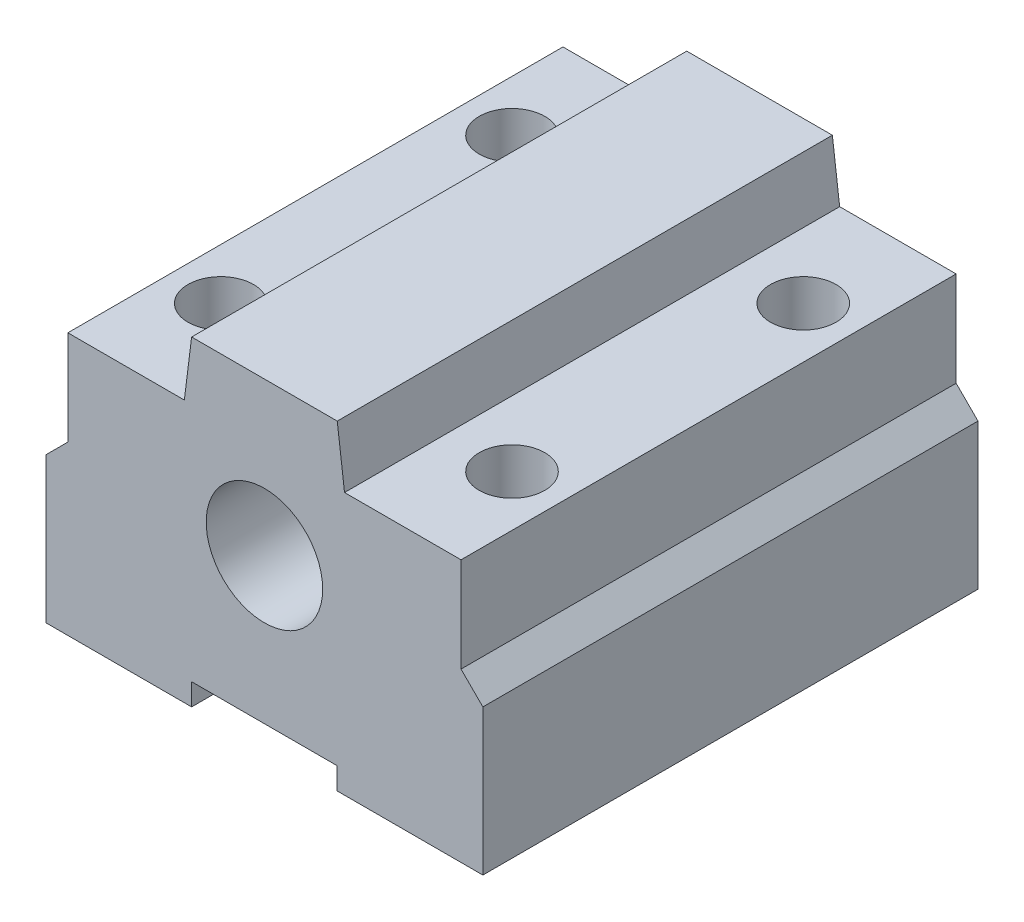
ISO-10303-21;
HEADER;
FILE_DESCRIPTION(('STEP AP214'),'2;1');
FILE_NAME('part.step','',(''),(''),'','','');
FILE_SCHEMA(('AUTOMOTIVE_DESIGN { 1 0 10303 214 1 1 1 1 }'));
ENDSEC;
DATA;
#1=APPLICATION_CONTEXT('core data for automotive mechanical design processes');
#2=APPLICATION_PROTOCOL_DEFINITION('international standard','automotive_design',2000,#1);
#3=PRODUCT_CONTEXT('',#1,'mechanical');
#4=PRODUCT('Part','Part','',(#3));
#5=PRODUCT_RELATED_PRODUCT_CATEGORY('part','',(#4));
#6=PRODUCT_DEFINITION_FORMATION('','',#4);
#7=PRODUCT_DEFINITION_CONTEXT('part definition',#1,'design');
#8=PRODUCT_DEFINITION('design','',#6,#7);
#9=PRODUCT_DEFINITION_SHAPE('','',#8);
#10=(LENGTH_UNIT() NAMED_UNIT(*) SI_UNIT(.MILLI.,.METRE.));
#11=(NAMED_UNIT(*) PLANE_ANGLE_UNIT() SI_UNIT($,.RADIAN.));
#12=(NAMED_UNIT(*) SI_UNIT($,.STERADIAN.) SOLID_ANGLE_UNIT());
#13=UNCERTAINTY_MEASURE_WITH_UNIT(LENGTH_MEASURE(1.E-05),#10,'distance_accuracy_value','');
#14=(GEOMETRIC_REPRESENTATION_CONTEXT(3) GLOBAL_UNCERTAINTY_ASSIGNED_CONTEXT((#13)) GLOBAL_UNIT_ASSIGNED_CONTEXT((#10,
#11,#12)) REPRESENTATION_CONTEXT('',''));
#15=CARTESIAN_POINT('',(0.,0.,0.));
#16=DIRECTION('',(0.,0.,1.));
#17=DIRECTION('',(1.,0.,0.));
#18=AXIS2_PLACEMENT_3D('',#15,#16,#17);
#19=CARTESIAN_POINT('',(-5.5,6.5,34.));
#20=DIRECTION('',(0.,-1.,0.));
#21=DIRECTION('',(1.,0.,0.));
#22=AXIS2_PLACEMENT_3D('',#19,#20,#21);
#23=PLANE('',#22);
#24=CARTESIAN_POINT('',(-10.,6.5,27.));
#25=DIRECTION('',(0.,-1.,0.));
#26=DIRECTION('',(0.,0.,1.));
#27=AXIS2_PLACEMENT_3D('',#24,#25,#26);
#28=CIRCLE('',#27,2.25);
#29=CARTESIAN_POINT('',(-10.,6.5,29.25));
#30=VERTEX_POINT('',#29);
#31=EDGE_CURVE('E305',#30,#30,#28,.T.);
#32=ORIENTED_EDGE('',*,*,#31,.T.);
#33=EDGE_LOOP('',(#32));
#34=FACE_BOUND('',#33,.T.);
#35=DIRECTION('',(-1.,0.,0.));
#36=VECTOR('',#35,1.);
#37=CARTESIAN_POINT('',(-5.5,6.5,0.));
#38=LINE('',#37,#36);
#39=CARTESIAN_POINT('',(-5.5,6.5,0.));
#40=VERTEX_POINT('',#39);
#41=CARTESIAN_POINT('',(-13.5,6.5,0.));
#42=VERTEX_POINT('',#41);
#43=EDGE_CURVE('E201',#40,#42,#38,.T.);
#44=ORIENTED_EDGE('',*,*,#43,.T.);
#45=DIRECTION('',(0.,0.,-1.));
#46=VECTOR('',#45,1.);
#47=CARTESIAN_POINT('',(-13.5,6.5,34.));
#48=LINE('',#47,#46);
#49=CARTESIAN_POINT('',(-13.5,6.5,34.));
#50=VERTEX_POINT('',#49);
#51=EDGE_CURVE('E212',#50,#42,#48,.T.);
#52=ORIENTED_EDGE('',*,*,#51,.F.);
#53=DIRECTION('',(-1.,0.,0.));
#54=VECTOR('',#53,1.);
#55=CARTESIAN_POINT('',(-5.5,6.5,34.));
#56=LINE('',#55,#54);
#57=CARTESIAN_POINT('',(-5.5,6.5,34.));
#58=VERTEX_POINT('',#57);
#59=EDGE_CURVE('E282',#58,#50,#56,.T.);
#60=ORIENTED_EDGE('',*,*,#59,.F.);
#61=DIRECTION('',(0.,0.,-1.));
#62=VECTOR('',#61,1.);
#63=CARTESIAN_POINT('',(-5.5,6.5,34.));
#64=LINE('',#63,#62);
#65=EDGE_CURVE('E215',#58,#40,#64,.T.);
#66=ORIENTED_EDGE('',*,*,#65,.T.);
#67=EDGE_LOOP('',(#44,#52,#60,#66));
#68=FACE_BOUND('',#67,.T.);
#69=CARTESIAN_POINT('',(-10.,6.5,7.));
#70=DIRECTION('',(0.,-1.,0.));
#71=DIRECTION('',(0.,0.,1.));
#72=AXIS2_PLACEMENT_3D('',#69,#70,#71);
#73=CIRCLE('',#72,2.25);
#74=CARTESIAN_POINT('',(-10.,6.5,9.25));
#75=VERTEX_POINT('',#74);
#76=EDGE_CURVE('E306',#75,#75,#73,.T.);
#77=ORIENTED_EDGE('',*,*,#76,.T.);
#78=EDGE_LOOP('',(#77));
#79=FACE_BOUND('',#78,.T.);
#80=ADVANCED_FACE('F31',(#34,#68,#79),#23,.F.);
#81=CARTESIAN_POINT('',(-5.,-11.5,34.));
#82=DIRECTION('',(0.,1.,0.));
#83=DIRECTION('',(-1.,0.,0.));
#84=AXIS2_PLACEMENT_3D('',#81,#82,#83);
#85=PLANE('',#84);
#86=CARTESIAN_POINT('',(-10.,-11.5,27.));
#87=DIRECTION('',(0.,-1.,0.));
#88=DIRECTION('',(0.,0.,1.));
#89=AXIS2_PLACEMENT_3D('',#86,#87,#88);
#90=CIRCLE('',#89,2.25);
#91=CARTESIAN_POINT('',(-10.,-11.5,29.25));
#92=VERTEX_POINT('',#91);
#93=EDGE_CURVE('E309',#92,#92,#90,.T.);
#94=ORIENTED_EDGE('',*,*,#93,.F.);
#95=EDGE_LOOP('',(#94));
#96=FACE_BOUND('',#95,.T.);
#97=DIRECTION('',(1.,0.,0.));
#98=VECTOR('',#97,1.);
#99=CARTESIAN_POINT('',(-5.,-11.5,0.));
#100=LINE('',#99,#98);
#101=CARTESIAN_POINT('',(-15.,-11.5,0.));
#102=VERTEX_POINT('',#101);
#103=CARTESIAN_POINT('',(-5.,-11.5,0.));
#104=VERTEX_POINT('',#103);
#105=EDGE_CURVE('E107',#102,#104,#100,.T.);
#106=ORIENTED_EDGE('',*,*,#105,.T.);
#107=DIRECTION('',(0.,0.,-1.));
#108=VECTOR('',#107,1.);
#109=CARTESIAN_POINT('',(-5.,-11.5,34.));
#110=LINE('',#109,#108);
#111=CARTESIAN_POINT('',(-5.,-11.5,34.));
#112=VERTEX_POINT('',#111);
#113=EDGE_CURVE('E173',#112,#104,#110,.T.);
#114=ORIENTED_EDGE('',*,*,#113,.F.);
#115=DIRECTION('',(1.,0.,0.));
#116=VECTOR('',#115,1.);
#117=CARTESIAN_POINT('',(-5.,-11.5,34.));
#118=LINE('',#117,#116);
#119=CARTESIAN_POINT('',(-15.,-11.5,34.));
#120=VERTEX_POINT('',#119);
#121=EDGE_CURVE('E48',#120,#112,#118,.T.);
#122=ORIENTED_EDGE('',*,*,#121,.F.);
#123=DIRECTION('',(0.,0.,-1.));
#124=VECTOR('',#123,1.);
#125=CARTESIAN_POINT('',(-15.,-11.5,34.));
#126=LINE('',#125,#124);
#127=EDGE_CURVE('E169',#120,#102,#126,.T.);
#128=ORIENTED_EDGE('',*,*,#127,.T.);
#129=EDGE_LOOP('',(#106,#114,#122,#128));
#130=FACE_BOUND('',#129,.T.);
#131=CARTESIAN_POINT('',(-10.,-11.5,7.));
#132=DIRECTION('',(0.,-1.,0.));
#133=DIRECTION('',(0.,0.,1.));
#134=AXIS2_PLACEMENT_3D('',#131,#132,#133);
#135=CIRCLE('',#134,2.25);
#136=CARTESIAN_POINT('',(-10.,-11.5,9.25));
#137=VERTEX_POINT('',#136);
#138=EDGE_CURVE('E303',#137,#137,#135,.T.);
#139=ORIENTED_EDGE('',*,*,#138,.F.);
#140=EDGE_LOOP('',(#139));
#141=FACE_BOUND('',#140,.T.);
#142=ADVANCED_FACE('F296',(#96,#130,#141),#85,.F.);
#143=CARTESIAN_POINT('',(-5.,-11.5,34.));
#144=DIRECTION('',(0.,0.,-1.));
#145=DIRECTION('',(-1.,0.,0.));
#146=AXIS2_PLACEMENT_3D('',#143,#144,#145);
#147=PLANE('',#146);
#148=DIRECTION('',(0.,1.,0.));
#149=VECTOR('',#148,1.);
#150=CARTESIAN_POINT('',(-5.,-10.,34.));
#151=LINE('',#150,#149);
#152=CARTESIAN_POINT('',(-5.,-10.,34.));
#153=VERTEX_POINT('',#152);
#154=EDGE_CURVE('E208',#112,#153,#151,.T.);
#155=ORIENTED_EDGE('',*,*,#154,.T.);
#156=DIRECTION('',(1.,0.,0.));
#157=VECTOR('',#156,1.);
#158=CARTESIAN_POINT('',(5.,-10.,34.));
#159=LINE('',#158,#157);
#160=CARTESIAN_POINT('',(5.,-10.,34.));
#161=VERTEX_POINT('',#160);
#162=EDGE_CURVE('E115',#153,#161,#159,.T.);
#163=ORIENTED_EDGE('',*,*,#162,.T.);
#164=DIRECTION('',(0.,-1.,0.));
#165=VECTOR('',#164,1.);
#166=CARTESIAN_POINT('',(5.,-10.,34.));
#167=LINE('',#166,#165);
#168=CARTESIAN_POINT('',(5.,-11.5,34.));
#169=VERTEX_POINT('',#168);
#170=EDGE_CURVE('E247',#161,#169,#167,.T.);
#171=ORIENTED_EDGE('',*,*,#170,.T.);
#172=DIRECTION('',(1.,0.,0.));
#173=VECTOR('',#172,1.);
#174=CARTESIAN_POINT('',(5.,-11.5,34.));
#175=LINE('',#174,#173);
#176=CARTESIAN_POINT('',(15.,-11.5,34.));
#177=VERTEX_POINT('',#176);
#178=EDGE_CURVE('E266',#169,#177,#175,.T.);
#179=ORIENTED_EDGE('',*,*,#178,.T.);
#180=DIRECTION('',(0.,1.,0.));
#181=VECTOR('',#180,1.);
#182=CARTESIAN_POINT('',(15.,-11.5,34.));
#183=LINE('',#182,#181);
#184=CARTESIAN_POINT('',(15.,-1.5,34.));
#185=VERTEX_POINT('',#184);
#186=EDGE_CURVE('E263',#177,#185,#183,.T.);
#187=ORIENTED_EDGE('',*,*,#186,.T.);
#188=DIRECTION('',(-0.707106781186546,0.707106781186549,0.));
#189=VECTOR('',#188,1.);
#190=CARTESIAN_POINT('',(15.,-1.5,34.));
#191=LINE('',#190,#189);
#192=CARTESIAN_POINT('',(13.5,0.,34.));
#193=VERTEX_POINT('',#192);
#194=EDGE_CURVE('E265',#185,#193,#191,.T.);
#195=ORIENTED_EDGE('',*,*,#194,.T.);
#196=DIRECTION('',(0.,1.,0.));
#197=VECTOR('',#196,1.);
#198=CARTESIAN_POINT('',(13.5,0.,34.));
#199=LINE('',#198,#197);
#200=CARTESIAN_POINT('',(13.5,6.5,34.));
#201=VERTEX_POINT('',#200);
#202=EDGE_CURVE('E268',#193,#201,#199,.T.);
#203=ORIENTED_EDGE('',*,*,#202,.T.);
#204=DIRECTION('',(-1.,0.,0.));
#205=VECTOR('',#204,1.);
#206=CARTESIAN_POINT('',(5.5,6.5,34.));
#207=LINE('',#206,#205);
#208=CARTESIAN_POINT('',(5.5,6.5,34.));
#209=VERTEX_POINT('',#208);
#210=EDGE_CURVE('E274',#201,#209,#207,.T.);
#211=ORIENTED_EDGE('',*,*,#210,.T.);
#212=DIRECTION('',(-0.124034734589209,0.992277876713668,0.));
#213=VECTOR('',#212,1.);
#214=CARTESIAN_POINT('',(5.,10.5,34.));
#215=LINE('',#214,#213);
#216=CARTESIAN_POINT('',(5.,10.5,34.));
#217=VERTEX_POINT('',#216);
#218=EDGE_CURVE('E276',#209,#217,#215,.T.);
#219=ORIENTED_EDGE('',*,*,#218,.T.);
#220=DIRECTION('',(-1.,0.,0.));
#221=VECTOR('',#220,1.);
#222=CARTESIAN_POINT('',(5.,10.5,34.));
#223=LINE('',#222,#221);
#224=CARTESIAN_POINT('',(-5.,10.5,34.));
#225=VERTEX_POINT('',#224);
#226=EDGE_CURVE('E278',#217,#225,#223,.T.);
#227=ORIENTED_EDGE('',*,*,#226,.T.);
#228=DIRECTION('',(-0.124034734589209,-0.992277876713668,0.));
#229=VECTOR('',#228,1.);
#230=CARTESIAN_POINT('',(-5.,10.5,34.));
#231=LINE('',#230,#229);
#232=EDGE_CURVE('E280',#225,#58,#231,.T.);
#233=ORIENTED_EDGE('',*,*,#232,.T.);
#234=ORIENTED_EDGE('',*,*,#59,.T.);
#235=DIRECTION('',(0.,-1.,0.));
#236=VECTOR('',#235,1.);
#237=CARTESIAN_POINT('',(-13.5,0.,34.));
#238=LINE('',#237,#236);
#239=CARTESIAN_POINT('',(-13.5,0.,34.));
#240=VERTEX_POINT('',#239);
#241=EDGE_CURVE('E159',#50,#240,#238,.T.);
#242=ORIENTED_EDGE('',*,*,#241,.T.);
#243=DIRECTION('',(-0.707106781186546,-0.707106781186549,0.));
#244=VECTOR('',#243,1.);
#245=CARTESIAN_POINT('',(-15.,-1.5,34.));
#246=LINE('',#245,#244);
#247=CARTESIAN_POINT('',(-15.,-1.5,34.));
#248=VERTEX_POINT('',#247);
#249=EDGE_CURVE('E152',#240,#248,#246,.T.);
#250=ORIENTED_EDGE('',*,*,#249,.T.);
#251=DIRECTION('',(0.,-1.,0.));
#252=VECTOR('',#251,1.);
#253=CARTESIAN_POINT('',(-15.,-11.5,34.));
#254=LINE('',#253,#252);
#255=EDGE_CURVE('E157',#248,#120,#254,.T.);
#256=ORIENTED_EDGE('',*,*,#255,.T.);
#257=ORIENTED_EDGE('',*,*,#121,.T.);
#258=EDGE_LOOP('',(#155,#163,#171,#179,#187,#195,#203,#211,#219,#227,#233,#234,#242,#250,#256,#257));
#259=FACE_BOUND('',#258,.T.);
#260=CARTESIAN_POINT('',(0.,0.,34.));
#261=DIRECTION('',(0.,0.,1.));
#262=DIRECTION('',(1.,0.,0.));
#263=AXIS2_PLACEMENT_3D('',#260,#261,#262);
#264=CIRCLE('',#263,4.);
#265=CARTESIAN_POINT('',(4.,0.,34.));
#266=VERTEX_POINT('',#265);
#267=EDGE_CURVE('E181',#266,#266,#264,.T.);
#268=ORIENTED_EDGE('',*,*,#267,.F.);
#269=EDGE_LOOP('',(#268));
#270=FACE_BOUND('',#269,.T.);
#271=ADVANCED_FACE('F154',(#259,#270),#147,.F.);
#272=CARTESIAN_POINT('',(-5.,-11.5,0.));
#273=DIRECTION('',(0.,0.,-1.));
#274=DIRECTION('',(-1.,0.,0.));
#275=AXIS2_PLACEMENT_3D('',#272,#273,#274);
#276=PLANE('',#275);
#277=DIRECTION('',(0.,1.,0.));
#278=VECTOR('',#277,1.);
#279=CARTESIAN_POINT('',(-5.,-10.,0.));
#280=LINE('',#279,#278);
#281=CARTESIAN_POINT('',(-5.,-10.,0.));
#282=VERTEX_POINT('',#281);
#283=EDGE_CURVE('E177',#104,#282,#280,.T.);
#284=ORIENTED_EDGE('',*,*,#283,.F.);
#285=ORIENTED_EDGE('',*,*,#105,.F.);
#286=DIRECTION('',(0.,-1.,0.));
#287=VECTOR('',#286,1.);
#288=CARTESIAN_POINT('',(-15.,-11.5,0.));
#289=LINE('',#288,#287);
#290=CARTESIAN_POINT('',(-15.,-1.5,0.));
#291=VERTEX_POINT('',#290);
#292=EDGE_CURVE('E101',#291,#102,#289,.T.);
#293=ORIENTED_EDGE('',*,*,#292,.F.);
#294=DIRECTION('',(-0.707106781186546,-0.707106781186549,0.));
#295=VECTOR('',#294,1.);
#296=CARTESIAN_POINT('',(-15.,-1.5,0.));
#297=LINE('',#296,#295);
#298=CARTESIAN_POINT('',(-13.5,0.,0.));
#299=VERTEX_POINT('',#298);
#300=EDGE_CURVE('E167',#299,#291,#297,.T.);
#301=ORIENTED_EDGE('',*,*,#300,.F.);
#302=DIRECTION('',(0.,-1.,0.));
#303=VECTOR('',#302,1.);
#304=CARTESIAN_POINT('',(-13.5,0.,0.));
#305=LINE('',#304,#303);
#306=EDGE_CURVE('E203',#42,#299,#305,.T.);
#307=ORIENTED_EDGE('',*,*,#306,.F.);
#308=ORIENTED_EDGE('',*,*,#43,.F.);
#309=DIRECTION('',(-0.124034734589209,-0.992277876713668,0.));
#310=VECTOR('',#309,1.);
#311=CARTESIAN_POINT('',(-5.,10.5,0.));
#312=LINE('',#311,#310);
#313=CARTESIAN_POINT('',(-5.,10.5,0.));
#314=VERTEX_POINT('',#313);
#315=EDGE_CURVE('E199',#314,#40,#312,.T.);
#316=ORIENTED_EDGE('',*,*,#315,.F.);
#317=DIRECTION('',(-1.,0.,0.));
#318=VECTOR('',#317,1.);
#319=CARTESIAN_POINT('',(5.,10.5,0.));
#320=LINE('',#319,#318);
#321=CARTESIAN_POINT('',(5.,10.5,0.));
#322=VERTEX_POINT('',#321);
#323=EDGE_CURVE('E197',#322,#314,#320,.T.);
#324=ORIENTED_EDGE('',*,*,#323,.F.);
#325=DIRECTION('',(-0.124034734589209,0.992277876713668,0.));
#326=VECTOR('',#325,1.);
#327=CARTESIAN_POINT('',(5.,10.5,0.));
#328=LINE('',#327,#326);
#329=CARTESIAN_POINT('',(5.5,6.5,0.));
#330=VERTEX_POINT('',#329);
#331=EDGE_CURVE('E195',#330,#322,#328,.T.);
#332=ORIENTED_EDGE('',*,*,#331,.F.);
#333=DIRECTION('',(-1.,0.,0.));
#334=VECTOR('',#333,1.);
#335=CARTESIAN_POINT('',(5.5,6.5,0.));
#336=LINE('',#335,#334);
#337=CARTESIAN_POINT('',(13.5,6.5,0.));
#338=VERTEX_POINT('',#337);
#339=EDGE_CURVE('E193',#338,#330,#336,.T.);
#340=ORIENTED_EDGE('',*,*,#339,.F.);
#341=DIRECTION('',(0.,1.,0.));
#342=VECTOR('',#341,1.);
#343=CARTESIAN_POINT('',(13.5,0.,0.));
#344=LINE('',#343,#342);
#345=CARTESIAN_POINT('',(13.5,0.,0.));
#346=VERTEX_POINT('',#345);
#347=EDGE_CURVE('E191',#346,#338,#344,.T.);
#348=ORIENTED_EDGE('',*,*,#347,.F.);
#349=DIRECTION('',(-0.707106781186546,0.707106781186549,0.));
#350=VECTOR('',#349,1.);
#351=CARTESIAN_POINT('',(15.,-1.5,0.));
#352=LINE('',#351,#350);
#353=CARTESIAN_POINT('',(15.,-1.5,0.));
#354=VERTEX_POINT('',#353);
#355=EDGE_CURVE('E189',#354,#346,#352,.T.);
#356=ORIENTED_EDGE('',*,*,#355,.F.);
#357=DIRECTION('',(0.,1.,0.));
#358=VECTOR('',#357,1.);
#359=CARTESIAN_POINT('',(15.,-11.5,0.));
#360=LINE('',#359,#358);
#361=CARTESIAN_POINT('',(15.,-11.5,0.));
#362=VERTEX_POINT('',#361);
#363=EDGE_CURVE('E187',#362,#354,#360,.T.);
#364=ORIENTED_EDGE('',*,*,#363,.F.);
#365=DIRECTION('',(1.,0.,0.));
#366=VECTOR('',#365,1.);
#367=CARTESIAN_POINT('',(5.,-11.5,0.));
#368=LINE('',#367,#366);
#369=CARTESIAN_POINT('',(5.,-11.5,0.));
#370=VERTEX_POINT('',#369);
#371=EDGE_CURVE('E185',#370,#362,#368,.T.);
#372=ORIENTED_EDGE('',*,*,#371,.F.);
#373=DIRECTION('',(0.,-1.,0.));
#374=VECTOR('',#373,1.);
#375=CARTESIAN_POINT('',(5.,-10.,0.));
#376=LINE('',#375,#374);
#377=CARTESIAN_POINT('',(5.,-10.,0.));
#378=VERTEX_POINT('',#377);
#379=EDGE_CURVE('E183',#378,#370,#376,.T.);
#380=ORIENTED_EDGE('',*,*,#379,.F.);
#381=DIRECTION('',(1.,0.,0.));
#382=VECTOR('',#381,1.);
#383=CARTESIAN_POINT('',(5.,-10.,0.));
#384=LINE('',#383,#382);
#385=EDGE_CURVE('E180',#282,#378,#384,.T.);
#386=ORIENTED_EDGE('',*,*,#385,.F.);
#387=EDGE_LOOP('',(#284,#285,#293,#301,#307,#308,#316,#324,#332,#340,#348,#356,#364,#372,#380,#386));
#388=FACE_BOUND('',#387,.T.);
#389=CARTESIAN_POINT('',(0.,0.,0.));
#390=DIRECTION('',(0.,0.,1.));
#391=DIRECTION('',(1.,0.,0.));
#392=AXIS2_PLACEMENT_3D('',#389,#390,#391);
#393=CIRCLE('',#392,4.);
#394=CARTESIAN_POINT('',(4.,0.,0.));
#395=VERTEX_POINT('',#394);
#396=EDGE_CURVE('E326',#395,#395,#393,.T.);
#397=ORIENTED_EDGE('',*,*,#396,.T.);
#398=EDGE_LOOP('',(#397));
#399=FACE_BOUND('',#398,.T.);
#400=ADVANCED_FACE('F251',(#388,#399),#276,.T.);
#401=CARTESIAN_POINT('',(-5.,-10.,34.));
#402=DIRECTION('',(-1.,0.,0.));
#403=DIRECTION('',(0.,0.,1.));
#404=AXIS2_PLACEMENT_3D('',#401,#402,#403);
#405=PLANE('',#404);
#406=ORIENTED_EDGE('',*,*,#283,.T.);
#407=DIRECTION('',(0.,0.,-1.));
#408=VECTOR('',#407,1.);
#409=CARTESIAN_POINT('',(-5.,-10.,34.));
#410=LINE('',#409,#408);
#411=EDGE_CURVE('E11',#153,#282,#410,.T.);
#412=ORIENTED_EDGE('',*,*,#411,.F.);
#413=ORIENTED_EDGE('',*,*,#154,.F.);
#414=ORIENTED_EDGE('',*,*,#113,.T.);
#415=EDGE_LOOP('',(#406,#412,#413,#414));
#416=FACE_BOUND('',#415,.T.);
#417=ADVANCED_FACE('F33',(#416),#405,.F.);
#418=CARTESIAN_POINT('',(5.,-10.,34.));
#419=DIRECTION('',(0.,1.,0.));
#420=DIRECTION('',(0.,0.,1.));
#421=AXIS2_PLACEMENT_3D('',#418,#419,#420);
#422=PLANE('',#421);
#423=ORIENTED_EDGE('',*,*,#385,.T.);
#424=DIRECTION('',(0.,0.,-1.));
#425=VECTOR('',#424,1.);
#426=CARTESIAN_POINT('',(5.,-10.,34.));
#427=LINE('',#426,#425);
#428=EDGE_CURVE('E40',#161,#378,#427,.T.);
#429=ORIENTED_EDGE('',*,*,#428,.F.);
#430=ORIENTED_EDGE('',*,*,#162,.F.);
#431=ORIENTED_EDGE('',*,*,#411,.T.);
#432=EDGE_LOOP('',(#423,#429,#430,#431));
#433=FACE_BOUND('',#432,.T.);
#434=ADVANCED_FACE('F388',(#433),#422,.F.);
#435=CARTESIAN_POINT('',(5.,-10.,34.));
#436=DIRECTION('',(1.,0.,0.));
#437=DIRECTION('',(0.,0.,-1.));
#438=AXIS2_PLACEMENT_3D('',#435,#436,#437);
#439=PLANE('',#438);
#440=ORIENTED_EDGE('',*,*,#379,.T.);
#441=DIRECTION('',(0.,0.,-1.));
#442=VECTOR('',#441,1.);
#443=CARTESIAN_POINT('',(5.,-11.5,34.));
#444=LINE('',#443,#442);
#445=EDGE_CURVE('E239',#169,#370,#444,.T.);
#446=ORIENTED_EDGE('',*,*,#445,.F.);
#447=ORIENTED_EDGE('',*,*,#170,.F.);
#448=ORIENTED_EDGE('',*,*,#428,.T.);
#449=EDGE_LOOP('',(#440,#446,#447,#448));
#450=FACE_BOUND('',#449,.T.);
#451=ADVANCED_FACE('F245',(#450),#439,.F.);
#452=CARTESIAN_POINT('',(5.,-11.5,34.));
#453=DIRECTION('',(0.,1.,0.));
#454=DIRECTION('',(0.,0.,1.));
#455=AXIS2_PLACEMENT_3D('',#452,#453,#454);
#456=PLANE('',#455);
#457=CARTESIAN_POINT('',(10.,-11.5,7.));
#458=DIRECTION('',(0.,1.,0.));
#459=DIRECTION('',(0.,0.,1.));
#460=AXIS2_PLACEMENT_3D('',#457,#458,#459);
#461=CIRCLE('',#460,2.25);
#462=CARTESIAN_POINT('',(10.,-11.5,9.25));
#463=VERTEX_POINT('',#462);
#464=EDGE_CURVE('E317',#463,#463,#461,.T.);
#465=ORIENTED_EDGE('',*,*,#464,.T.);
#466=EDGE_LOOP('',(#465));
#467=FACE_BOUND('',#466,.T.);
#468=CARTESIAN_POINT('',(10.,-11.5,27.));
#469=DIRECTION('',(0.,1.,0.));
#470=DIRECTION('',(0.,0.,1.));
#471=AXIS2_PLACEMENT_3D('',#468,#469,#470);
#472=CIRCLE('',#471,2.25);
#473=CARTESIAN_POINT('',(10.,-11.5,29.25));
#474=VERTEX_POINT('',#473);
#475=EDGE_CURVE('E323',#474,#474,#472,.T.);
#476=ORIENTED_EDGE('',*,*,#475,.T.);
#477=EDGE_LOOP('',(#476));
#478=FACE_BOUND('',#477,.T.);
#479=ORIENTED_EDGE('',*,*,#371,.T.);
#480=DIRECTION('',(0.,0.,-1.));
#481=VECTOR('',#480,1.);
#482=CARTESIAN_POINT('',(15.,-11.5,34.));
#483=LINE('',#482,#481);
#484=EDGE_CURVE('E236',#177,#362,#483,.T.);
#485=ORIENTED_EDGE('',*,*,#484,.F.);
#486=ORIENTED_EDGE('',*,*,#178,.F.);
#487=ORIENTED_EDGE('',*,*,#445,.T.);
#488=EDGE_LOOP('',(#479,#485,#486,#487));
#489=FACE_BOUND('',#488,.T.);
#490=ADVANCED_FACE('F257',(#467,#478,#489),#456,.F.);
#491=CARTESIAN_POINT('',(15.,-11.5,34.));
#492=DIRECTION('',(-1.,0.,0.));
#493=DIRECTION('',(0.,-1.,0.));
#494=AXIS2_PLACEMENT_3D('',#491,#492,#493);
#495=PLANE('',#494);
#496=ORIENTED_EDGE('',*,*,#363,.T.);
#497=DIRECTION('',(0.,0.,-1.));
#498=VECTOR('',#497,1.);
#499=CARTESIAN_POINT('',(15.,-1.5,34.));
#500=LINE('',#499,#498);
#501=EDGE_CURVE('E233',#185,#354,#500,.T.);
#502=ORIENTED_EDGE('',*,*,#501,.F.);
#503=ORIENTED_EDGE('',*,*,#186,.F.);
#504=ORIENTED_EDGE('',*,*,#484,.T.);
#505=EDGE_LOOP('',(#496,#502,#503,#504));
#506=FACE_BOUND('',#505,.T.);
#507=ADVANCED_FACE('F261',(#506),#495,.F.);
#508=CARTESIAN_POINT('',(15.,-1.5,34.));
#509=DIRECTION('',(-0.707106781186549,-0.707106781186546,0.));
#510=DIRECTION('',(0.707106781186546,-0.707106781186549,0.));
#511=AXIS2_PLACEMENT_3D('',#508,#509,#510);
#512=PLANE('',#511);
#513=ORIENTED_EDGE('',*,*,#355,.T.);
#514=DIRECTION('',(0.,0.,-1.));
#515=VECTOR('',#514,1.);
#516=CARTESIAN_POINT('',(13.5,0.,34.));
#517=LINE('',#516,#515);
#518=EDGE_CURVE('E230',#193,#346,#517,.T.);
#519=ORIENTED_EDGE('',*,*,#518,.F.);
#520=ORIENTED_EDGE('',*,*,#194,.F.);
#521=ORIENTED_EDGE('',*,*,#501,.T.);
#522=EDGE_LOOP('',(#513,#519,#520,#521));
#523=FACE_BOUND('',#522,.T.);
#524=ADVANCED_FACE('F377',(#523),#512,.F.);
#525=CARTESIAN_POINT('',(13.5,0.,34.));
#526=DIRECTION('',(-1.,0.,0.));
#527=DIRECTION('',(0.,0.,1.));
#528=AXIS2_PLACEMENT_3D('',#525,#526,#527);
#529=PLANE('',#528);
#530=ORIENTED_EDGE('',*,*,#347,.T.);
#531=DIRECTION('',(0.,0.,-1.));
#532=VECTOR('',#531,1.);
#533=CARTESIAN_POINT('',(13.5,6.5,34.));
#534=LINE('',#533,#532);
#535=EDGE_CURVE('E227',#201,#338,#534,.T.);
#536=ORIENTED_EDGE('',*,*,#535,.F.);
#537=ORIENTED_EDGE('',*,*,#202,.F.);
#538=ORIENTED_EDGE('',*,*,#518,.T.);
#539=EDGE_LOOP('',(#530,#536,#537,#538));
#540=FACE_BOUND('',#539,.T.);
#541=ADVANCED_FACE('F373',(#540),#529,.F.);
#542=CARTESIAN_POINT('',(5.5,6.5,34.));
#543=DIRECTION('',(0.,-1.,0.));
#544=DIRECTION('',(0.,0.,-1.));
#545=AXIS2_PLACEMENT_3D('',#542,#543,#544);
#546=PLANE('',#545);
#547=CARTESIAN_POINT('',(10.,6.5,7.));
#548=DIRECTION('',(0.,1.,0.));
#549=DIRECTION('',(0.,0.,1.));
#550=AXIS2_PLACEMENT_3D('',#547,#548,#549);
#551=CIRCLE('',#550,2.25);
#552=CARTESIAN_POINT('',(10.,6.5,9.25));
#553=VERTEX_POINT('',#552);
#554=EDGE_CURVE('E315',#553,#553,#551,.T.);
#555=ORIENTED_EDGE('',*,*,#554,.F.);
#556=EDGE_LOOP('',(#555));
#557=FACE_BOUND('',#556,.T.);
#558=CARTESIAN_POINT('',(10.,6.5,27.));
#559=DIRECTION('',(0.,1.,0.));
#560=DIRECTION('',(0.,0.,1.));
#561=AXIS2_PLACEMENT_3D('',#558,#559,#560);
#562=CIRCLE('',#561,2.25);
#563=CARTESIAN_POINT('',(10.,6.5,29.25));
#564=VERTEX_POINT('',#563);
#565=EDGE_CURVE('E320',#564,#564,#562,.T.);
#566=ORIENTED_EDGE('',*,*,#565,.F.);
#567=EDGE_LOOP('',(#566));
#568=FACE_BOUND('',#567,.T.);
#569=ORIENTED_EDGE('',*,*,#339,.T.);
#570=DIRECTION('',(0.,0.,-1.));
#571=VECTOR('',#570,1.);
#572=CARTESIAN_POINT('',(5.5,6.5,34.));
#573=LINE('',#572,#571);
#574=EDGE_CURVE('E224',#209,#330,#573,.T.);
#575=ORIENTED_EDGE('',*,*,#574,.F.);
#576=ORIENTED_EDGE('',*,*,#210,.F.);
#577=ORIENTED_EDGE('',*,*,#535,.T.);
#578=EDGE_LOOP('',(#569,#575,#576,#577));
#579=FACE_BOUND('',#578,.T.);
#580=ADVANCED_FACE('F369',(#557,#568,#579),#546,.F.);
#581=CARTESIAN_POINT('',(5.,10.5,34.));
#582=DIRECTION('',(-0.992277876713668,-0.124034734589209,0.));
#583=DIRECTION('',(0.124034734589209,-0.992277876713668,0.));
#584=AXIS2_PLACEMENT_3D('',#581,#582,#583);
#585=PLANE('',#584);
#586=ORIENTED_EDGE('',*,*,#331,.T.);
#587=DIRECTION('',(0.,0.,-1.));
#588=VECTOR('',#587,1.);
#589=CARTESIAN_POINT('',(5.,10.5,34.));
#590=LINE('',#589,#588);
#591=EDGE_CURVE('E221',#217,#322,#590,.T.);
#592=ORIENTED_EDGE('',*,*,#591,.F.);
#593=ORIENTED_EDGE('',*,*,#218,.F.);
#594=ORIENTED_EDGE('',*,*,#574,.T.);
#595=EDGE_LOOP('',(#586,#592,#593,#594));
#596=FACE_BOUND('',#595,.T.);
#597=ADVANCED_FACE('F365',(#596),#585,.F.);
#598=CARTESIAN_POINT('',(5.,10.5,34.));
#599=DIRECTION('',(0.,-1.,0.));
#600=DIRECTION('',(1.,0.,0.));
#601=AXIS2_PLACEMENT_3D('',#598,#599,#600);
#602=PLANE('',#601);
#603=ORIENTED_EDGE('',*,*,#323,.T.);
#604=DIRECTION('',(0.,0.,-1.));
#605=VECTOR('',#604,1.);
#606=CARTESIAN_POINT('',(-5.,10.5,34.));
#607=LINE('',#606,#605);
#608=EDGE_CURVE('E218',#225,#314,#607,.T.);
#609=ORIENTED_EDGE('',*,*,#608,.F.);
#610=ORIENTED_EDGE('',*,*,#226,.F.);
#611=ORIENTED_EDGE('',*,*,#591,.T.);
#612=EDGE_LOOP('',(#603,#609,#610,#611));
#613=FACE_BOUND('',#612,.T.);
#614=ADVANCED_FACE('F361',(#613),#602,.F.);
#615=CARTESIAN_POINT('',(-5.,10.5,34.));
#616=DIRECTION('',(0.992277876713668,-0.124034734589209,0.));
#617=DIRECTION('',(0.124034734589209,0.992277876713668,0.));
#618=AXIS2_PLACEMENT_3D('',#615,#616,#617);
#619=PLANE('',#618);
#620=ORIENTED_EDGE('',*,*,#315,.T.);
#621=ORIENTED_EDGE('',*,*,#65,.F.);
#622=ORIENTED_EDGE('',*,*,#232,.F.);
#623=ORIENTED_EDGE('',*,*,#608,.T.);
#624=EDGE_LOOP('',(#620,#621,#622,#623));
#625=FACE_BOUND('',#624,.T.);
#626=ADVANCED_FACE('F358',(#625),#619,.F.);
#627=CARTESIAN_POINT('',(-13.5,0.,34.));
#628=DIRECTION('',(1.,0.,0.));
#629=DIRECTION('',(0.,1.,0.));
#630=AXIS2_PLACEMENT_3D('',#627,#628,#629);
#631=PLANE('',#630);
#632=ORIENTED_EDGE('',*,*,#306,.T.);
#633=DIRECTION('',(0.,0.,-1.));
#634=VECTOR('',#633,1.);
#635=CARTESIAN_POINT('',(-13.5,0.,34.));
#636=LINE('',#635,#634);
#637=EDGE_CURVE('E168',#240,#299,#636,.T.);
#638=ORIENTED_EDGE('',*,*,#637,.F.);
#639=ORIENTED_EDGE('',*,*,#241,.F.);
#640=ORIENTED_EDGE('',*,*,#51,.T.);
#641=EDGE_LOOP('',(#632,#638,#639,#640));
#642=FACE_BOUND('',#641,.T.);
#643=ADVANCED_FACE('F292',(#642),#631,.F.);
#644=CARTESIAN_POINT('',(-15.,-1.5,34.));
#645=DIRECTION('',(0.707106781186549,-0.707106781186546,0.));
#646=DIRECTION('',(0.707106781186546,0.707106781186549,0.));
#647=AXIS2_PLACEMENT_3D('',#644,#645,#646);
#648=PLANE('',#647);
#649=ORIENTED_EDGE('',*,*,#300,.T.);
#650=DIRECTION('',(0.,0.,-1.));
#651=VECTOR('',#650,1.);
#652=CARTESIAN_POINT('',(-15.,-1.5,34.));
#653=LINE('',#652,#651);
#654=EDGE_CURVE('E164',#248,#291,#653,.T.);
#655=ORIENTED_EDGE('',*,*,#654,.F.);
#656=ORIENTED_EDGE('',*,*,#249,.F.);
#657=ORIENTED_EDGE('',*,*,#637,.T.);
#658=EDGE_LOOP('',(#649,#655,#656,#657));
#659=FACE_BOUND('',#658,.T.);
#660=ADVANCED_FACE('F165',(#659),#648,.F.);
#661=CARTESIAN_POINT('',(-15.,-11.5,34.));
#662=DIRECTION('',(1.,0.,0.));
#663=DIRECTION('',(0.,1.,0.));
#664=AXIS2_PLACEMENT_3D('',#661,#662,#663);
#665=PLANE('',#664);
#666=ORIENTED_EDGE('',*,*,#292,.T.);
#667=ORIENTED_EDGE('',*,*,#127,.F.);
#668=ORIENTED_EDGE('',*,*,#255,.F.);
#669=ORIENTED_EDGE('',*,*,#654,.T.);
#670=EDGE_LOOP('',(#666,#667,#668,#669));
#671=FACE_BOUND('',#670,.T.);
#672=ADVANCED_FACE('F171',(#671),#665,.F.);
#673=CARTESIAN_POINT('',(0.,0.,34.));
#674=DIRECTION('',(0.,0.,-1.));
#675=DIRECTION('',(-1.,0.,0.));
#676=AXIS2_PLACEMENT_3D('',#673,#674,#675);
#677=CYLINDRICAL_SURFACE('',#676,4.);
#678=ORIENTED_EDGE('',*,*,#267,.T.);
#679=EDGE_LOOP('',(#678));
#680=FACE_BOUND('',#679,.T.);
#681=ORIENTED_EDGE('',*,*,#396,.F.);
#682=EDGE_LOOP('',(#681));
#683=FACE_BOUND('',#682,.T.);
#684=ADVANCED_FACE('F336',(#680,#683),#677,.F.);
#685=CARTESIAN_POINT('',(10.,-11.5,27.));
#686=DIRECTION('',(0.,1.,0.));
#687=DIRECTION('',(0.,0.,1.));
#688=AXIS2_PLACEMENT_3D('',#685,#686,#687);
#689=CYLINDRICAL_SURFACE('',#688,2.25);
#690=ORIENTED_EDGE('',*,*,#475,.F.);
#691=EDGE_LOOP('',(#690));
#692=FACE_BOUND('',#691,.T.);
#693=ORIENTED_EDGE('',*,*,#565,.T.);
#694=EDGE_LOOP('',(#693));
#695=FACE_BOUND('',#694,.T.);
#696=ADVANCED_FACE('F338',(#692,#695),#689,.F.);
#697=CARTESIAN_POINT('',(10.,-11.5,7.));
#698=DIRECTION('',(0.,1.,0.));
#699=DIRECTION('',(0.,0.,1.));
#700=AXIS2_PLACEMENT_3D('',#697,#698,#699);
#701=CYLINDRICAL_SURFACE('',#700,2.25);
#702=ORIENTED_EDGE('',*,*,#464,.F.);
#703=EDGE_LOOP('',(#702));
#704=FACE_BOUND('',#703,.T.);
#705=ORIENTED_EDGE('',*,*,#554,.T.);
#706=EDGE_LOOP('',(#705));
#707=FACE_BOUND('',#706,.T.);
#708=ADVANCED_FACE('F345',(#704,#707),#701,.F.);
#709=CARTESIAN_POINT('',(-10.,-11.5,27.));
#710=DIRECTION('',(0.,1.,0.));
#711=DIRECTION('',(0.,0.,1.));
#712=AXIS2_PLACEMENT_3D('',#709,#710,#711);
#713=CYLINDRICAL_SURFACE('',#712,2.25);
#714=ORIENTED_EDGE('',*,*,#93,.T.);
#715=EDGE_LOOP('',(#714));
#716=FACE_BOUND('',#715,.T.);
#717=ORIENTED_EDGE('',*,*,#31,.F.);
#718=EDGE_LOOP('',(#717));
#719=FACE_BOUND('',#718,.T.);
#720=ADVANCED_FACE('F476',(#716,#719),#713,.F.);
#721=CARTESIAN_POINT('',(-10.,-11.5,7.));
#722=DIRECTION('',(0.,1.,0.));
#723=DIRECTION('',(0.,0.,1.));
#724=AXIS2_PLACEMENT_3D('',#721,#722,#723);
#725=CYLINDRICAL_SURFACE('',#724,2.25);
#726=ORIENTED_EDGE('',*,*,#138,.T.);
#727=EDGE_LOOP('',(#726));
#728=FACE_BOUND('',#727,.T.);
#729=ORIENTED_EDGE('',*,*,#76,.F.);
#730=EDGE_LOOP('',(#729));
#731=FACE_BOUND('',#730,.T.);
#732=ADVANCED_FACE('F481',(#728,#731),#725,.F.);
#733=CLOSED_SHELL('',(#80,#142,#271,#400,#417,#434,#451,#490,#507,#524,#541,#580,#597,#614,#626,
#643,#660,#672,#684,#696,#708,#720,#732));
#734=MANIFOLD_SOLID_BREP('B2',#733);
#735=ADVANCED_BREP_SHAPE_REPRESENTATION('',(#18,#734),#14);
#736=SHAPE_DEFINITION_REPRESENTATION(#9,#735);
ENDSEC;
END-ISO-10303-21;
